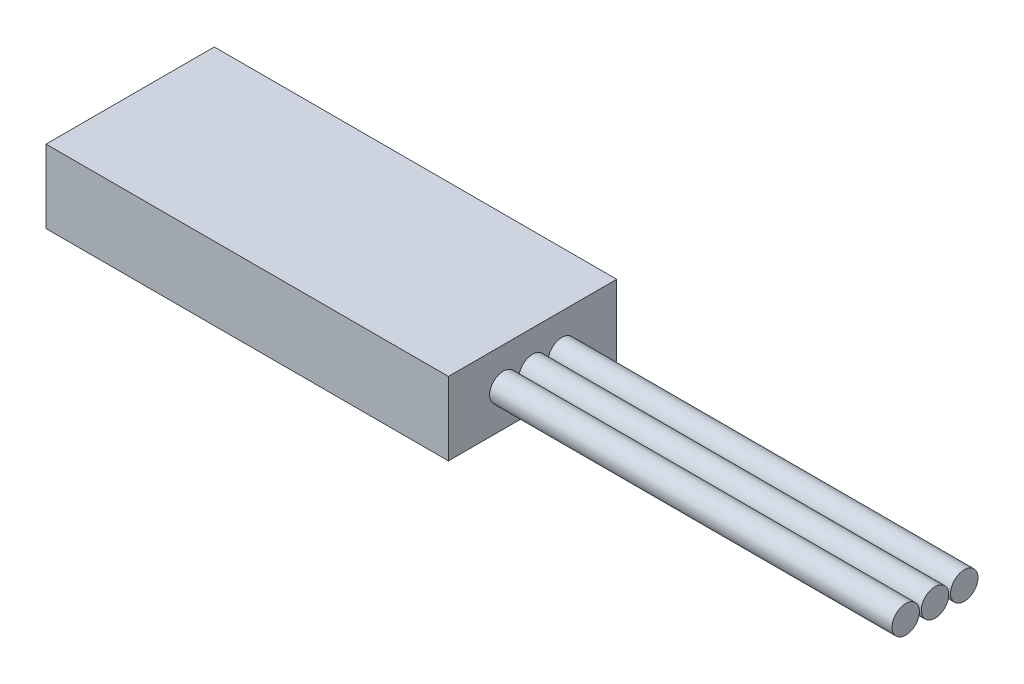
ISO-10303-21;
HEADER;
FILE_DESCRIPTION(('STEP AP214'),'2;1');
FILE_NAME('part.step','',(''),(''),'','','');
FILE_SCHEMA(('AUTOMOTIVE_DESIGN { 1 0 10303 214 1 1 1 1 }'));
ENDSEC;
DATA;
#1=APPLICATION_CONTEXT('core data for automotive mechanical design processes');
#2=APPLICATION_PROTOCOL_DEFINITION('international standard','automotive_design',2000,#1);
#3=PRODUCT_CONTEXT('',#1,'mechanical');
#4=PRODUCT('Part','Part','',(#3));
#5=PRODUCT_RELATED_PRODUCT_CATEGORY('part','',(#4));
#6=PRODUCT_DEFINITION_FORMATION('','',#4);
#7=PRODUCT_DEFINITION_CONTEXT('part definition',#1,'design');
#8=PRODUCT_DEFINITION('design','',#6,#7);
#9=PRODUCT_DEFINITION_SHAPE('','',#8);
#10=(LENGTH_UNIT() NAMED_UNIT(*) SI_UNIT(.MILLI.,.METRE.));
#11=(NAMED_UNIT(*) PLANE_ANGLE_UNIT() SI_UNIT($,.RADIAN.));
#12=(NAMED_UNIT(*) SI_UNIT($,.STERADIAN.) SOLID_ANGLE_UNIT());
#13=UNCERTAINTY_MEASURE_WITH_UNIT(LENGTH_MEASURE(1.E-05),#10,'distance_accuracy_value','');
#14=(GEOMETRIC_REPRESENTATION_CONTEXT(3) GLOBAL_UNCERTAINTY_ASSIGNED_CONTEXT((#13)) GLOBAL_UNIT_ASSIGNED_CONTEXT((#10,
#11,#12)) REPRESENTATION_CONTEXT('',''));
#15=CARTESIAN_POINT('',(0.,0.,0.));
#16=DIRECTION('',(0.,0.,1.));
#17=DIRECTION('',(1.,0.,0.));
#18=AXIS2_PLACEMENT_3D('',#15,#16,#17);
#19=CARTESIAN_POINT('',(0.,0.,0.));
#20=DIRECTION('',(-1.00000000000001,0.,0.));
#21=DIRECTION('',(0.,0.,1.00000000000001));
#22=AXIS2_PLACEMENT_3D('',#19,#20,#21);
#23=PLANE('',#22);
#24=DIRECTION('',(0.,1.,0.));
#25=VECTOR('',#24,1.);
#26=CARTESIAN_POINT('',(0.,-2.00000000000003,-4.59999999999999));
#27=LINE('',#26,#25);
#28=CARTESIAN_POINT('',(0.,-2.00000000000003,-4.59999999999999));
#29=VERTEX_POINT('',#28);
#30=CARTESIAN_POINT('',(0.,1.99999999999997,-4.60000000000004));
#31=VERTEX_POINT('',#30);
#32=EDGE_CURVE('E132',#29,#31,#27,.T.);
#33=ORIENTED_EDGE('',*,*,#32,.F.);
#34=DIRECTION('',(0.,0.,-1.00000000000001));
#35=VECTOR('',#34,1.);
#36=CARTESIAN_POINT('',(0.,-2.0000000000001,4.60000000000005));
#37=LINE('',#36,#35);
#38=CARTESIAN_POINT('',(0.,-2.0000000000001,4.60000000000005));
#39=VERTEX_POINT('',#38);
#40=EDGE_CURVE('E79',#39,#29,#37,.T.);
#41=ORIENTED_EDGE('',*,*,#40,.F.);
#42=DIRECTION('',(0.,-1.,0.));
#43=VECTOR('',#42,1.);
#44=CARTESIAN_POINT('',(0.,-2.0000000000001,4.60000000000005));
#45=LINE('',#44,#43);
#46=CARTESIAN_POINT('',(0.,1.9999999999999,4.60000000000001));
#47=VERTEX_POINT('',#46);
#48=EDGE_CURVE('E164',#47,#39,#45,.T.);
#49=ORIENTED_EDGE('',*,*,#48,.F.);
#50=DIRECTION('',(0.,0.,1.00000000000001));
#51=VECTOR('',#50,1.);
#52=CARTESIAN_POINT('',(0.,1.9999999999999,4.60000000000001));
#53=LINE('',#52,#51);
#54=EDGE_CURVE('E136',#31,#47,#53,.T.);
#55=ORIENTED_EDGE('',*,*,#54,.F.);
#56=EDGE_LOOP('',(#33,#41,#49,#55));
#57=FACE_BOUND('',#56,.T.);
#58=DIRECTION('',(0.,0.,-1.00000000000001));
#59=VECTOR('',#58,1.);
#60=CARTESIAN_POINT('',(0.,-1.5,0.));
#61=LINE('',#60,#59);
#62=CARTESIAN_POINT('',(0.,-1.50000000000006,4.10000000000004));
#63=VERTEX_POINT('',#62);
#64=CARTESIAN_POINT('',(0.,-1.50000000000003,-4.1));
#65=VERTEX_POINT('',#64);
#66=EDGE_CURVE('E127',#63,#65,#61,.T.);
#67=ORIENTED_EDGE('',*,*,#66,.T.);
#68=DIRECTION('',(0.,1.,0.));
#69=VECTOR('',#68,1.);
#70=CARTESIAN_POINT('',(0.,0.,-4.09999999999999));
#71=LINE('',#70,#69);
#72=CARTESIAN_POINT('',(0.,1.49999999999997,-4.09999999999992));
#73=VERTEX_POINT('',#72);
#74=EDGE_CURVE('E149',#65,#73,#71,.T.);
#75=ORIENTED_EDGE('',*,*,#74,.T.);
#76=DIRECTION('',(0.,0.,1.00000000000001));
#77=VECTOR('',#76,1.);
#78=CARTESIAN_POINT('',(0.,1.5,0.));
#79=LINE('',#78,#77);
#80=CARTESIAN_POINT('',(0.,1.49999999999995,4.10000000000009));
#81=VERTEX_POINT('',#80);
#82=EDGE_CURVE('E131',#73,#81,#79,.T.);
#83=ORIENTED_EDGE('',*,*,#82,.T.);
#84=DIRECTION('',(0.,-1.,0.));
#85=VECTOR('',#84,1.);
#86=CARTESIAN_POINT('',(0.,0.,4.10000000000008));
#87=LINE('',#86,#85);
#88=EDGE_CURVE('E49',#81,#63,#87,.T.);
#89=ORIENTED_EDGE('',*,*,#88,.T.);
#90=EDGE_LOOP('',(#67,#75,#83,#89));
#91=FACE_BOUND('',#90,.T.);
#92=ADVANCED_FACE('F34',(#57,#91),#23,.T.);
#93=CARTESIAN_POINT('',(22.0000000000003,-1.99999999999995,-4.60000000000017));
#94=DIRECTION('',(0.,0.,1.00000000000001));
#95=DIRECTION('',(1.00000000000001,0.,0.));
#96=AXIS2_PLACEMENT_3D('',#93,#94,#95);
#97=PLANE('',#96);
#98=ORIENTED_EDGE('',*,*,#32,.T.);
#99=DIRECTION('',(-1.00000000000001,0.,0.));
#100=VECTOR('',#99,1.);
#101=CARTESIAN_POINT('',(22.0000000000003,2.00000000000006,-4.60000000000025));
#102=LINE('',#101,#100);
#103=CARTESIAN_POINT('',(22.0000000000003,2.00000000000006,-4.60000000000025));
#104=VERTEX_POINT('',#103);
#105=EDGE_CURVE('E173',#104,#31,#102,.T.);
#106=ORIENTED_EDGE('',*,*,#105,.F.);
#107=DIRECTION('',(0.,1.,0.));
#108=VECTOR('',#107,1.);
#109=CARTESIAN_POINT('',(22.0000000000003,-1.99999999999995,-4.60000000000017));
#110=LINE('',#109,#108);
#111=CARTESIAN_POINT('',(22.0000000000003,-1.99999999999995,-4.60000000000017));
#112=VERTEX_POINT('',#111);
#113=EDGE_CURVE('E156',#112,#104,#110,.T.);
#114=ORIENTED_EDGE('',*,*,#113,.F.);
#115=DIRECTION('',(-1.00000000000001,0.,0.));
#116=VECTOR('',#115,1.);
#117=CARTESIAN_POINT('',(22.0000000000003,-1.99999999999995,-4.60000000000017));
#118=LINE('',#117,#116);
#119=EDGE_CURVE('E161',#112,#29,#118,.T.);
#120=ORIENTED_EDGE('',*,*,#119,.T.);
#121=EDGE_LOOP('',(#98,#106,#114,#120));
#122=FACE_BOUND('',#121,.T.);
#123=ADVANCED_FACE('F36',(#122),#97,.F.);
#124=CARTESIAN_POINT('',(22.0000000000003,2.00000000000006,4.59999999999983));
#125=DIRECTION('',(0.,-1.,0.));
#126=DIRECTION('',(0.,0.,-1.00000000000001));
#127=AXIS2_PLACEMENT_3D('',#124,#125,#126);
#128=PLANE('',#127);
#129=ORIENTED_EDGE('',*,*,#54,.T.);
#130=DIRECTION('',(-1.00000000000001,0.,0.));
#131=VECTOR('',#130,1.);
#132=CARTESIAN_POINT('',(22.0000000000003,2.00000000000006,4.59999999999983));
#133=LINE('',#132,#131);
#134=CARTESIAN_POINT('',(22.0000000000003,2.00000000000006,4.59999999999983));
#135=VERTEX_POINT('',#134);
#136=EDGE_CURVE('E170',#135,#47,#133,.T.);
#137=ORIENTED_EDGE('',*,*,#136,.F.);
#138=DIRECTION('',(0.,0.,1.00000000000001));
#139=VECTOR('',#138,1.);
#140=CARTESIAN_POINT('',(22.0000000000003,2.00000000000006,4.59999999999983));
#141=LINE('',#140,#139);
#142=EDGE_CURVE('E87',#104,#135,#141,.T.);
#143=ORIENTED_EDGE('',*,*,#142,.F.);
#144=ORIENTED_EDGE('',*,*,#105,.T.);
#145=EDGE_LOOP('',(#129,#137,#143,#144));
#146=FACE_BOUND('',#145,.T.);
#147=ADVANCED_FACE('F191',(#146),#128,.F.);
#148=CARTESIAN_POINT('',(22.0000000000003,-1.99999999999995,4.59999999999996));
#149=DIRECTION('',(0.,0.,-1.00000000000001));
#150=DIRECTION('',(-1.00000000000001,0.,0.));
#151=AXIS2_PLACEMENT_3D('',#148,#149,#150);
#152=PLANE('',#151);
#153=ORIENTED_EDGE('',*,*,#48,.T.);
#154=DIRECTION('',(-1.00000000000001,0.,0.));
#155=VECTOR('',#154,1.);
#156=CARTESIAN_POINT('',(22.0000000000003,-1.99999999999995,4.59999999999996));
#157=LINE('',#156,#155);
#158=CARTESIAN_POINT('',(22.0000000000003,-1.99999999999995,4.59999999999996));
#159=VERTEX_POINT('',#158);
#160=EDGE_CURVE('E168',#159,#39,#157,.T.);
#161=ORIENTED_EDGE('',*,*,#160,.F.);
#162=DIRECTION('',(0.,-1.,0.));
#163=VECTOR('',#162,1.);
#164=CARTESIAN_POINT('',(22.0000000000003,-1.99999999999995,4.59999999999996));
#165=LINE('',#164,#163);
#166=EDGE_CURVE('E159',#135,#159,#165,.T.);
#167=ORIENTED_EDGE('',*,*,#166,.F.);
#168=ORIENTED_EDGE('',*,*,#136,.T.);
#169=EDGE_LOOP('',(#153,#161,#167,#168));
#170=FACE_BOUND('',#169,.T.);
#171=ADVANCED_FACE('F196',(#170),#152,.F.);
#172=CARTESIAN_POINT('',(22.0000000000003,-1.99999999999995,4.59999999999996));
#173=DIRECTION('',(0.,1.,0.));
#174=DIRECTION('',(0.,0.,1.00000000000001));
#175=AXIS2_PLACEMENT_3D('',#172,#173,#174);
#176=PLANE('',#175);
#177=ORIENTED_EDGE('',*,*,#40,.T.);
#178=ORIENTED_EDGE('',*,*,#119,.F.);
#179=DIRECTION('',(0.,0.,-1.00000000000001));
#180=VECTOR('',#179,1.);
#181=CARTESIAN_POINT('',(22.0000000000003,-1.99999999999995,4.59999999999996));
#182=LINE('',#181,#180);
#183=EDGE_CURVE('E58',#159,#112,#182,.T.);
#184=ORIENTED_EDGE('',*,*,#183,.F.);
#185=ORIENTED_EDGE('',*,*,#160,.T.);
#186=EDGE_LOOP('',(#177,#178,#184,#185));
#187=FACE_BOUND('',#186,.T.);
#188=ADVANCED_FACE('F184',(#187),#176,.F.);
#189=CARTESIAN_POINT('',(22.0000000000003,2.22044604925031E-13,-1.2490009027033E-13));
#190=DIRECTION('',(-1.00000000000001,0.,0.));
#191=DIRECTION('',(0.,0.,1.00000000000001));
#192=AXIS2_PLACEMENT_3D('',#189,#190,#191);
#193=PLANE('',#192);
#194=CARTESIAN_POINT('',(22.0000000000003,0.,-1.60000000000013));
#195=DIRECTION('',(-1.00000000000001,0.,0.));
#196=DIRECTION('',(0.,0.,1.00000000000001));
#197=AXIS2_PLACEMENT_3D('',#194,#195,#196);
#198=CIRCLE('',#197,0.75);
#199=CARTESIAN_POINT('',(22.0000000000003,0.,-0.850000000000118));
#200=VERTEX_POINT('',#199);
#201=EDGE_CURVE('E11',#200,#200,#198,.F.);
#202=ORIENTED_EDGE('',*,*,#201,.F.);
#203=EDGE_LOOP('',(#202));
#204=FACE_BOUND('',#203,.T.);
#205=CARTESIAN_POINT('',(22.0000000000003,-1.11022302462516E-13,1.59999999999987));
#206=DIRECTION('',(-1.00000000000001,0.,0.));
#207=DIRECTION('',(0.,0.,1.00000000000001));
#208=AXIS2_PLACEMENT_3D('',#205,#206,#207);
#209=CIRCLE('',#208,0.75);
#210=CARTESIAN_POINT('',(22.0000000000003,-1.11022302462516E-13,2.34999999999988));
#211=VERTEX_POINT('',#210);
#212=EDGE_CURVE('E42',#211,#211,#209,.F.);
#213=ORIENTED_EDGE('',*,*,#212,.F.);
#214=EDGE_LOOP('',(#213));
#215=FACE_BOUND('',#214,.T.);
#216=CARTESIAN_POINT('',(22.0000000000003,2.22044604925031E-13,-1.2490009027033E-13));
#217=DIRECTION('',(1.00000000000001,0.,0.));
#218=DIRECTION('',(0.,0.,-1.00000000000001));
#219=AXIS2_PLACEMENT_3D('',#216,#217,#218);
#220=CIRCLE('',#219,0.75);
#221=CARTESIAN_POINT('',(22.0000000000003,2.22044604925031E-13,-0.750000000000136));
#222=VERTEX_POINT('',#221);
#223=EDGE_CURVE('E141',#222,#222,#220,.T.);
#224=ORIENTED_EDGE('',*,*,#223,.F.);
#225=EDGE_LOOP('',(#224));
#226=FACE_BOUND('',#225,.T.);
#227=ORIENTED_EDGE('',*,*,#113,.T.);
#228=ORIENTED_EDGE('',*,*,#142,.T.);
#229=ORIENTED_EDGE('',*,*,#166,.T.);
#230=ORIENTED_EDGE('',*,*,#183,.T.);
#231=EDGE_LOOP('',(#227,#228,#229,#230));
#232=FACE_BOUND('',#231,.T.);
#233=ADVANCED_FACE('F182',(#204,#215,#226,#232),#193,.F.);
#234=CARTESIAN_POINT('',(22.0000000000003,-2.00000000000002,-4.10000000000017));
#235=DIRECTION('',(0.,0.,1.00000000000001));
#236=DIRECTION('',(1.00000000000001,0.,0.));
#237=AXIS2_PLACEMENT_3D('',#234,#235,#236);
#238=PLANE('',#237);
#239=ORIENTED_EDGE('',*,*,#74,.F.);
#240=DIRECTION('',(-1.00000000000001,0.,0.));
#241=VECTOR('',#240,1.);
#242=CARTESIAN_POINT('',(22.0000000000003,-1.50000000000002,-4.10000000000023));
#243=LINE('',#242,#241);
#244=CARTESIAN_POINT('',(21.5000000000003,-1.50000000000002,-4.10000000000023));
#245=VERTEX_POINT('',#244);
#246=EDGE_CURVE('E126',#245,#65,#243,.T.);
#247=ORIENTED_EDGE('',*,*,#246,.F.);
#248=DIRECTION('',(0.,1.,0.));
#249=VECTOR('',#248,1.);
#250=CARTESIAN_POINT('',(21.5000000000003,0.,-4.10000000000013));
#251=LINE('',#250,#249);
#252=CARTESIAN_POINT('',(21.5000000000003,1.49999999999999,-4.1000000000001));
#253=VERTEX_POINT('',#252);
#254=EDGE_CURVE('E114',#245,#253,#251,.T.);
#255=ORIENTED_EDGE('',*,*,#254,.T.);
#256=DIRECTION('',(-1.00000000000001,0.,0.));
#257=VECTOR('',#256,1.);
#258=CARTESIAN_POINT('',(22.0000000000003,1.49999999999999,-4.1000000000001));
#259=LINE('',#258,#257);
#260=EDGE_CURVE('E124',#253,#73,#259,.T.);
#261=ORIENTED_EDGE('',*,*,#260,.T.);
#262=EDGE_LOOP('',(#239,#247,#255,#261));
#263=FACE_BOUND('',#262,.T.);
#264=ADVANCED_FACE('F123',(#263),#238,.T.);
#265=CARTESIAN_POINT('',(22.0000000000003,1.50000000000006,4.59999999999999));
#266=DIRECTION('',(0.,-1.,0.));
#267=DIRECTION('',(0.,0.,-1.00000000000001));
#268=AXIS2_PLACEMENT_3D('',#265,#266,#267);
#269=PLANE('',#268);
#270=ORIENTED_EDGE('',*,*,#82,.F.);
#271=ORIENTED_EDGE('',*,*,#260,.F.);
#272=DIRECTION('',(0.,0.,1.00000000000001));
#273=VECTOR('',#272,1.);
#274=CARTESIAN_POINT('',(21.5000000000003,1.50000000000022,0.));
#275=LINE('',#274,#273);
#276=CARTESIAN_POINT('',(21.5000000000003,1.4999999999999,4.09999999999999));
#277=VERTEX_POINT('',#276);
#278=EDGE_CURVE('E110',#253,#277,#275,.T.);
#279=ORIENTED_EDGE('',*,*,#278,.T.);
#280=DIRECTION('',(-1.00000000000001,0.,0.));
#281=VECTOR('',#280,1.);
#282=CARTESIAN_POINT('',(22.0000000000003,1.4999999999999,4.09999999999999));
#283=LINE('',#282,#281);
#284=EDGE_CURVE('E133',#277,#81,#283,.T.);
#285=ORIENTED_EDGE('',*,*,#284,.T.);
#286=EDGE_LOOP('',(#270,#271,#279,#285));
#287=FACE_BOUND('',#286,.T.);
#288=ADVANCED_FACE('F129',(#287),#269,.T.);
#289=CARTESIAN_POINT('',(22.0000000000003,-2.0000000000001,4.09999999999994));
#290=DIRECTION('',(0.,0.,-1.00000000000001));
#291=DIRECTION('',(-1.00000000000001,0.,0.));
#292=AXIS2_PLACEMENT_3D('',#289,#290,#291);
#293=PLANE('',#292);
#294=ORIENTED_EDGE('',*,*,#88,.F.);
#295=ORIENTED_EDGE('',*,*,#284,.F.);
#296=DIRECTION('',(0.,-1.,0.));
#297=VECTOR('',#296,1.);
#298=CARTESIAN_POINT('',(21.5000000000003,0.,4.10000000000008));
#299=LINE('',#298,#297);
#300=CARTESIAN_POINT('',(21.5000000000003,-1.5000000000001,4.09999999999984));
#301=VERTEX_POINT('',#300);
#302=EDGE_CURVE('E115',#277,#301,#299,.T.);
#303=ORIENTED_EDGE('',*,*,#302,.T.);
#304=DIRECTION('',(-1.00000000000001,0.,0.));
#305=VECTOR('',#304,1.);
#306=CARTESIAN_POINT('',(22.0000000000003,-1.5000000000001,4.09999999999986));
#307=LINE('',#306,#305);
#308=EDGE_CURVE('E138',#301,#63,#307,.T.);
#309=ORIENTED_EDGE('',*,*,#308,.T.);
#310=EDGE_LOOP('',(#294,#295,#303,#309));
#311=FACE_BOUND('',#310,.T.);
#312=ADVANCED_FACE('F205',(#311),#293,.T.);
#313=CARTESIAN_POINT('',(22.0000000000003,-1.49999999999995,4.59999999999986));
#314=DIRECTION('',(0.,1.,0.));
#315=DIRECTION('',(0.,0.,1.00000000000001));
#316=AXIS2_PLACEMENT_3D('',#313,#314,#315);
#317=PLANE('',#316);
#318=ORIENTED_EDGE('',*,*,#66,.F.);
#319=ORIENTED_EDGE('',*,*,#308,.F.);
#320=DIRECTION('',(0.,0.,-1.00000000000001));
#321=VECTOR('',#320,1.);
#322=CARTESIAN_POINT('',(21.5000000000003,-1.49999999999978,-1.90819582357449E-13));
#323=LINE('',#322,#321);
#324=EDGE_CURVE('E144',#301,#245,#323,.T.);
#325=ORIENTED_EDGE('',*,*,#324,.T.);
#326=ORIENTED_EDGE('',*,*,#246,.T.);
#327=EDGE_LOOP('',(#318,#319,#325,#326));
#328=FACE_BOUND('',#327,.T.);
#329=ADVANCED_FACE('F204',(#328),#317,.T.);
#330=CARTESIAN_POINT('',(21.5000000000003,2.22044604925031E-13,-1.2490009027033E-13));
#331=DIRECTION('',(-1.00000000000001,0.,0.));
#332=DIRECTION('',(0.,0.,1.00000000000001));
#333=AXIS2_PLACEMENT_3D('',#330,#331,#332);
#334=PLANE('',#333);
#335=ORIENTED_EDGE('',*,*,#254,.F.);
#336=ORIENTED_EDGE('',*,*,#324,.F.);
#337=ORIENTED_EDGE('',*,*,#302,.F.);
#338=ORIENTED_EDGE('',*,*,#278,.F.);
#339=EDGE_LOOP('',(#335,#336,#337,#338));
#340=FACE_BOUND('',#339,.T.);
#341=ADVANCED_FACE('F112',(#340),#334,.T.);
#342=CARTESIAN_POINT('',(44.0000000000005,0.,-1.76941794549634E-13));
#343=DIRECTION('',(-1.00000000000001,0.,0.));
#344=DIRECTION('',(0.,0.,1.00000000000001));
#345=AXIS2_PLACEMENT_3D('',#342,#343,#344);
#346=CYLINDRICAL_SURFACE('',#345,0.75);
#347=CARTESIAN_POINT('',(44.0000000000005,0.,-1.76941794549634E-13));
#348=DIRECTION('',(1.00000000000001,0.,0.));
#349=DIRECTION('',(0.,0.,-1.00000000000001));
#350=AXIS2_PLACEMENT_3D('',#347,#348,#349);
#351=CIRCLE('',#350,0.75);
#352=CARTESIAN_POINT('',(44.0000000000005,0.,-0.750000000000188));
#353=VERTEX_POINT('',#352);
#354=EDGE_CURVE('E151',#353,#353,#351,.T.);
#355=ORIENTED_EDGE('',*,*,#354,.F.);
#356=EDGE_LOOP('',(#355));
#357=FACE_BOUND('',#356,.T.);
#358=ORIENTED_EDGE('',*,*,#223,.T.);
#359=EDGE_LOOP('',(#358));
#360=FACE_BOUND('',#359,.T.);
#361=ADVANCED_FACE('F180',(#357,#360),#346,.T.);
#362=CARTESIAN_POINT('',(44.0000000000005,0.,-1.76941794549634E-13));
#363=DIRECTION('',(1.00000000000001,0.,0.));
#364=DIRECTION('',(0.,0.,-1.00000000000001));
#365=AXIS2_PLACEMENT_3D('',#362,#363,#364);
#366=PLANE('',#365);
#367=ORIENTED_EDGE('',*,*,#354,.T.);
#368=EDGE_LOOP('',(#367));
#369=FACE_BOUND('',#368,.T.);
#370=ADVANCED_FACE('F272',(#369),#366,.T.);
#371=CARTESIAN_POINT('',(44.0000000000005,0.,1.59999999999981));
#372=DIRECTION('',(-1.00000000000001,0.,0.));
#373=DIRECTION('',(0.,0.,1.00000000000001));
#374=AXIS2_PLACEMENT_3D('',#371,#372,#373);
#375=CYLINDRICAL_SURFACE('',#374,0.75);
#376=CARTESIAN_POINT('',(44.0000000000005,0.,1.59999999999981));
#377=DIRECTION('',(1.00000000000001,0.,0.));
#378=DIRECTION('',(0.,0.,-1.00000000000001));
#379=AXIS2_PLACEMENT_3D('',#376,#377,#378);
#380=CIRCLE('',#379,0.75);
#381=CARTESIAN_POINT('',(44.0000000000005,0.,0.849999999999802));
#382=VERTEX_POINT('',#381);
#383=EDGE_CURVE('E334',#382,#382,#380,.T.);
#384=ORIENTED_EDGE('',*,*,#383,.F.);
#385=EDGE_LOOP('',(#384));
#386=FACE_BOUND('',#385,.T.);
#387=ORIENTED_EDGE('',*,*,#212,.T.);
#388=EDGE_LOOP('',(#387));
#389=FACE_BOUND('',#388,.T.);
#390=ADVANCED_FACE('F283',(#386,#389),#375,.T.);
#391=CARTESIAN_POINT('',(44.0000000000005,0.,1.59999999999981));
#392=DIRECTION('',(1.00000000000001,0.,0.));
#393=DIRECTION('',(0.,0.,-1.00000000000001));
#394=AXIS2_PLACEMENT_3D('',#391,#392,#393);
#395=PLANE('',#394);
#396=ORIENTED_EDGE('',*,*,#383,.T.);
#397=EDGE_LOOP('',(#396));
#398=FACE_BOUND('',#397,.T.);
#399=ADVANCED_FACE('F292',(#398),#395,.T.);
#400=CARTESIAN_POINT('',(44.0000000000005,0.,-1.60000000000018));
#401=DIRECTION('',(-1.00000000000001,0.,0.));
#402=DIRECTION('',(0.,0.,1.00000000000001));
#403=AXIS2_PLACEMENT_3D('',#400,#401,#402);
#404=CYLINDRICAL_SURFACE('',#403,0.75);
#405=CARTESIAN_POINT('',(44.0000000000005,0.,-1.60000000000018));
#406=DIRECTION('',(1.00000000000001,0.,0.));
#407=DIRECTION('',(0.,0.,-1.00000000000001));
#408=AXIS2_PLACEMENT_3D('',#405,#406,#407);
#409=CIRCLE('',#408,0.75);
#410=CARTESIAN_POINT('',(44.0000000000005,0.,-2.35000000000019));
#411=VERTEX_POINT('',#410);
#412=EDGE_CURVE('E333',#411,#411,#409,.T.);
#413=ORIENTED_EDGE('',*,*,#412,.F.);
#414=EDGE_LOOP('',(#413));
#415=FACE_BOUND('',#414,.T.);
#416=ORIENTED_EDGE('',*,*,#201,.T.);
#417=EDGE_LOOP('',(#416));
#418=FACE_BOUND('',#417,.T.);
#419=ADVANCED_FACE('F301',(#415,#418),#404,.T.);
#420=CARTESIAN_POINT('',(44.0000000000005,0.,-1.60000000000018));
#421=DIRECTION('',(1.00000000000001,0.,0.));
#422=DIRECTION('',(0.,0.,-1.00000000000001));
#423=AXIS2_PLACEMENT_3D('',#420,#421,#422);
#424=PLANE('',#423);
#425=ORIENTED_EDGE('',*,*,#412,.T.);
#426=EDGE_LOOP('',(#425));
#427=FACE_BOUND('',#426,.T.);
#428=ADVANCED_FACE('F310',(#427),#424,.T.);
#429=CLOSED_SHELL('',(#92,#123,#147,#171,#188,#233,#264,#288,#312,#329,#341,#361,#370,#390,#399,
#419,#428));
#430=MANIFOLD_SOLID_BREP('B2',#429);
#431=ADVANCED_BREP_SHAPE_REPRESENTATION('',(#18,#430),#14);
#432=SHAPE_DEFINITION_REPRESENTATION(#9,#431);
ENDSEC;
END-ISO-10303-21;
